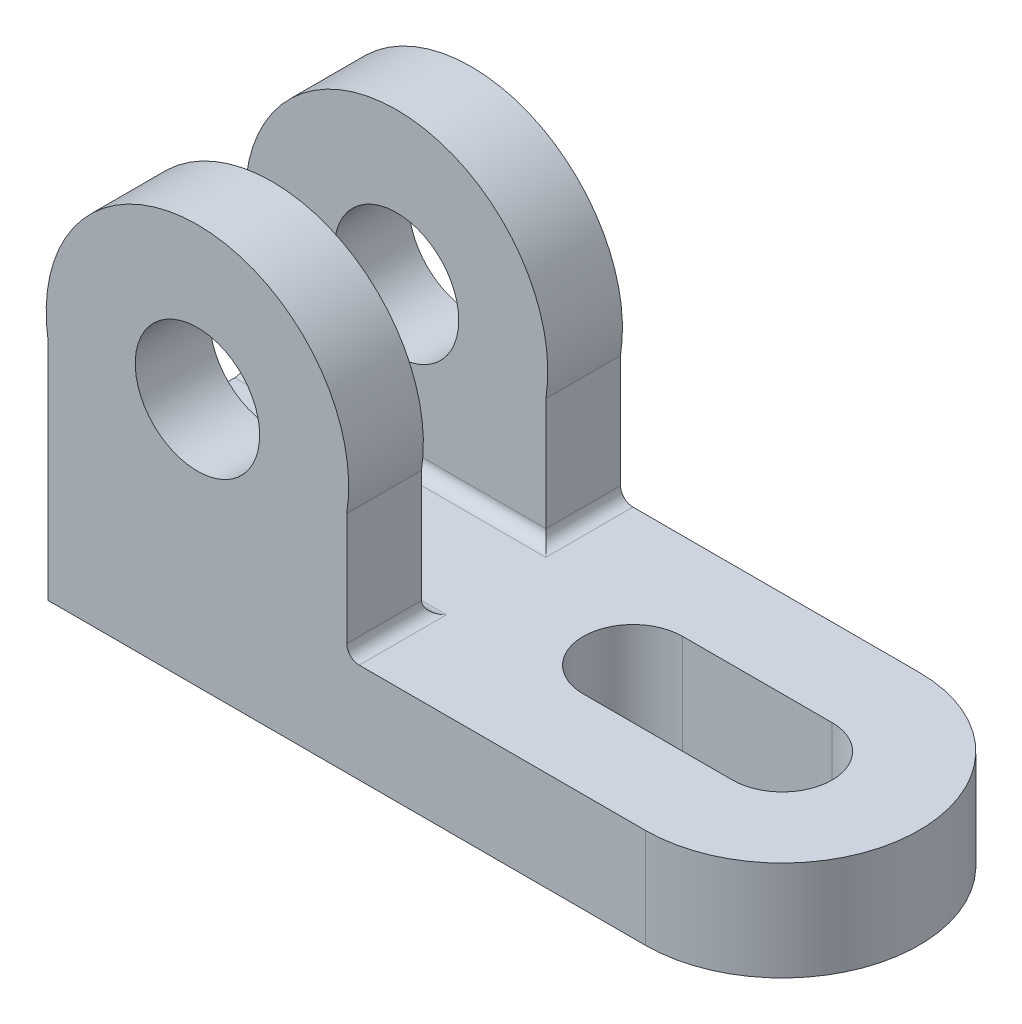
ISO-10303-21;
HEADER;
FILE_DESCRIPTION(('STEP AP214'),'2;1');
FILE_NAME('part.step','',(''),(''),'','','');
FILE_SCHEMA(('AUTOMOTIVE_DESIGN { 1 0 10303 214 1 1 1 1 }'));
ENDSEC;
DATA;
#1=APPLICATION_CONTEXT('core data for automotive mechanical design processes');
#2=APPLICATION_PROTOCOL_DEFINITION('international standard','automotive_design',2000,#1);
#3=PRODUCT_CONTEXT('',#1,'mechanical');
#4=PRODUCT('Part','Part','',(#3));
#5=PRODUCT_RELATED_PRODUCT_CATEGORY('part','',(#4));
#6=PRODUCT_DEFINITION_FORMATION('','',#4);
#7=PRODUCT_DEFINITION_CONTEXT('part definition',#1,'design');
#8=PRODUCT_DEFINITION('design','',#6,#7);
#9=PRODUCT_DEFINITION_SHAPE('','',#8);
#10=(LENGTH_UNIT() NAMED_UNIT(*) SI_UNIT(.MILLI.,.METRE.));
#11=(NAMED_UNIT(*) PLANE_ANGLE_UNIT() SI_UNIT($,.RADIAN.));
#12=(NAMED_UNIT(*) SI_UNIT($,.STERADIAN.) SOLID_ANGLE_UNIT());
#13=UNCERTAINTY_MEASURE_WITH_UNIT(LENGTH_MEASURE(1.E-05),#10,'distance_accuracy_value','');
#14=(GEOMETRIC_REPRESENTATION_CONTEXT(3) GLOBAL_UNCERTAINTY_ASSIGNED_CONTEXT((#13)) GLOBAL_UNIT_ASSIGNED_CONTEXT((#10,
#11,#12)) REPRESENTATION_CONTEXT('',''));
#15=CARTESIAN_POINT('',(0.,0.,0.));
#16=DIRECTION('',(0.,0.,1.));
#17=DIRECTION('',(1.,0.,0.));
#18=AXIS2_PLACEMENT_3D('',#15,#16,#17);
#19=CARTESIAN_POINT('',(0.,16.,0.));
#20=DIRECTION('',(0.,1.,0.));
#21=DIRECTION('',(0.,0.,1.));
#22=AXIS2_PLACEMENT_3D('',#19,#20,#21);
#23=PLANE('',#22);
#24=CARTESIAN_POINT('',(37.,16.,0.));
#25=DIRECTION('',(0.,1.,0.));
#26=DIRECTION('',(0.,0.,1.));
#27=AXIS2_PLACEMENT_3D('',#24,#25,#26);
#28=CIRCLE('',#27,8.);
#29=CARTESIAN_POINT('',(37.,16.,8.));
#30=VERTEX_POINT('',#29);
#31=CARTESIAN_POINT('',(37.,16.,-8.));
#32=VERTEX_POINT('',#31);
#33=EDGE_CURVE('E238',#30,#32,#28,.T.);
#34=ORIENTED_EDGE('',*,*,#33,.F.);
#35=DIRECTION('',(1.,0.,0.));
#36=VECTOR('',#35,1.);
#37=CARTESIAN_POINT('',(37.,16.,8.));
#38=LINE('',#37,#36);
#39=CARTESIAN_POINT('',(13.,16.,8.00000000000001));
#40=VERTEX_POINT('',#39);
#41=EDGE_CURVE('E247',#40,#30,#38,.T.);
#42=ORIENTED_EDGE('',*,*,#41,.F.);
#43=CARTESIAN_POINT('',(13.,16.,0.));
#44=DIRECTION('',(0.,1.,0.));
#45=DIRECTION('',(0.,0.,1.));
#46=AXIS2_PLACEMENT_3D('',#43,#44,#45);
#47=CIRCLE('',#46,8.00000000000001);
#48=CARTESIAN_POINT('',(13.,16.,-8.));
#49=VERTEX_POINT('',#48);
#50=EDGE_CURVE('E266',#49,#40,#47,.T.);
#51=ORIENTED_EDGE('',*,*,#50,.F.);
#52=DIRECTION('',(-1.,0.,0.));
#53=VECTOR('',#52,1.);
#54=CARTESIAN_POINT('',(37.,16.,-8.));
#55=LINE('',#54,#53);
#56=EDGE_CURVE('E262',#32,#49,#55,.T.);
#57=ORIENTED_EDGE('',*,*,#56,.F.);
#58=EDGE_LOOP('',(#34,#42,#51,#57));
#59=FACE_BOUND('',#58,.T.);
#60=DIRECTION('',(-1.,0.,0.));
#61=VECTOR('',#60,1.);
#62=CARTESIAN_POINT('',(0.,16.,8.));
#63=LINE('',#62,#61);
#64=CARTESIAN_POINT('',(-59.,16.,8.));
#65=VERTEX_POINT('',#64);
#66=CARTESIAN_POINT('',(-8.99999999999998,16.,8.));
#67=VERTEX_POINT('',#66);
#68=EDGE_CURVE('E334',#65,#67,#63,.F.);
#69=ORIENTED_EDGE('',*,*,#68,.T.);
#70=DIRECTION('',(0.,0.,1.));
#71=VECTOR('',#70,1.);
#72=CARTESIAN_POINT('',(-8.99999999999998,16.,22.));
#73=LINE('',#72,#71);
#74=CARTESIAN_POINT('',(-8.99999999999998,16.,22.));
#75=VERTEX_POINT('',#74);
#76=EDGE_CURVE('E337',#67,#75,#73,.T.);
#77=ORIENTED_EDGE('',*,*,#76,.T.);
#78=DIRECTION('',(1.,0.,0.));
#79=VECTOR('',#78,1.);
#80=CARTESIAN_POINT('',(0.,16.,22.));
#81=LINE('',#80,#79);
#82=CARTESIAN_POINT('',(37.,16.,22.));
#83=VERTEX_POINT('',#82);
#84=EDGE_CURVE('E286',#75,#83,#81,.T.);
#85=ORIENTED_EDGE('',*,*,#84,.T.);
#86=CARTESIAN_POINT('',(37.,16.,0.));
#87=DIRECTION('',(0.,1.,0.));
#88=DIRECTION('',(0.,0.,1.));
#89=AXIS2_PLACEMENT_3D('',#86,#87,#88);
#90=CIRCLE('',#89,22.);
#91=CARTESIAN_POINT('',(37.,16.,-22.));
#92=VERTEX_POINT('',#91);
#93=EDGE_CURVE('E289',#83,#92,#90,.T.);
#94=ORIENTED_EDGE('',*,*,#93,.T.);
#95=DIRECTION('',(1.,0.,0.));
#96=VECTOR('',#95,1.);
#97=CARTESIAN_POINT('',(0.,16.,-22.));
#98=LINE('',#97,#96);
#99=CARTESIAN_POINT('',(-8.99999999999998,16.,-22.));
#100=VERTEX_POINT('',#99);
#101=EDGE_CURVE('E294',#100,#92,#98,.T.);
#102=ORIENTED_EDGE('',*,*,#101,.F.);
#103=DIRECTION('',(0.,0.,-1.));
#104=VECTOR('',#103,1.);
#105=CARTESIAN_POINT('',(-8.99999999999998,16.,0.));
#106=LINE('',#105,#104);
#107=CARTESIAN_POINT('',(-8.99999999999998,16.,-8.));
#108=VERTEX_POINT('',#107);
#109=EDGE_CURVE('E331',#100,#108,#106,.F.);
#110=ORIENTED_EDGE('',*,*,#109,.T.);
#111=DIRECTION('',(-1.,0.,0.));
#112=VECTOR('',#111,1.);
#113=CARTESIAN_POINT('',(0.,16.,-8.));
#114=LINE('',#113,#112);
#115=CARTESIAN_POINT('',(-59.,16.,-8.));
#116=VERTEX_POINT('',#115);
#117=EDGE_CURVE('E328',#108,#116,#114,.T.);
#118=ORIENTED_EDGE('',*,*,#117,.T.);
#119=DIRECTION('',(0.,0.,1.));
#120=VECTOR('',#119,1.);
#121=CARTESIAN_POINT('',(-59.,16.,0.));
#122=LINE('',#121,#120);
#123=EDGE_CURVE('E297',#116,#65,#122,.T.);
#124=ORIENTED_EDGE('',*,*,#123,.T.);
#125=EDGE_LOOP('',(#69,#77,#85,#94,#102,#110,#118,#124));
#126=FACE_BOUND('',#125,.T.);
#127=ADVANCED_FACE('F43',(#59,#126),#23,.T.);
#128=CARTESIAN_POINT('',(0.,16.,22.));
#129=DIRECTION('',(0.,0.,-1.));
#130=DIRECTION('',(-1.,0.,0.));
#131=AXIS2_PLACEMENT_3D('',#128,#129,#130);
#132=PLANE('',#131);
#133=DIRECTION('',(1.,0.,0.));
#134=VECTOR('',#133,1.);
#135=CARTESIAN_POINT('',(0.,0.,22.));
#136=LINE('',#135,#134);
#137=CARTESIAN_POINT('',(-59.,0.,22.));
#138=VERTEX_POINT('',#137);
#139=CARTESIAN_POINT('',(37.,0.,22.));
#140=VERTEX_POINT('',#139);
#141=EDGE_CURVE('E276',#138,#140,#136,.T.);
#142=ORIENTED_EDGE('',*,*,#141,.T.);
#143=DIRECTION('',(0.,-1.,0.));
#144=VECTOR('',#143,1.);
#145=CARTESIAN_POINT('',(37.,16.,22.));
#146=LINE('',#145,#144);
#147=EDGE_CURVE('E324',#83,#140,#146,.T.);
#148=ORIENTED_EDGE('',*,*,#147,.F.);
#149=ORIENTED_EDGE('',*,*,#84,.F.);
#150=CARTESIAN_POINT('',(-8.99999999999998,18.,22.));
#151=DIRECTION('',(0.,0.,-1.));
#152=DIRECTION('',(-1.,0.,0.));
#153=AXIS2_PLACEMENT_3D('',#150,#151,#152);
#154=CIRCLE('',#153,2.);
#155=CARTESIAN_POINT('',(-11.,18.,22.));
#156=VERTEX_POINT('',#155);
#157=EDGE_CURVE('E352',#75,#156,#154,.T.);
#158=ORIENTED_EDGE('',*,*,#157,.T.);
#159=DIRECTION('',(0.,1.,0.));
#160=VECTOR('',#159,1.);
#161=CARTESIAN_POINT('',(-11.,0.,22.));
#162=LINE('',#161,#160);
#163=CARTESIAN_POINT('',(-11.,36.0945300116001,22.));
#164=VERTEX_POINT('',#163);
#165=EDGE_CURVE('E214',#156,#164,#162,.T.);
#166=ORIENTED_EDGE('',*,*,#165,.T.);
#167=CARTESIAN_POINT('',(-35.,40.,22.));
#168=DIRECTION('',(0.,0.,1.));
#169=DIRECTION('',(1.,0.,0.));
#170=AXIS2_PLACEMENT_3D('',#167,#168,#169);
#171=CIRCLE('',#170,24.3156882656093);
#172=CARTESIAN_POINT('',(-59.,36.0945300116001,22.));
#173=VERTEX_POINT('',#172);
#174=EDGE_CURVE('E228',#164,#173,#171,.T.);
#175=ORIENTED_EDGE('',*,*,#174,.T.);
#176=DIRECTION('',(0.,-1.,0.));
#177=VECTOR('',#176,1.);
#178=CARTESIAN_POINT('',(-59.,16.,22.));
#179=LINE('',#178,#177);
#180=EDGE_CURVE('E301',#173,#138,#179,.T.);
#181=ORIENTED_EDGE('',*,*,#180,.T.);
#182=EDGE_LOOP('',(#142,#148,#149,#158,#166,#175,#181));
#183=FACE_BOUND('',#182,.T.);
#184=CARTESIAN_POINT('',(-35.,40.,22.));
#185=DIRECTION('',(0.,0.,1.));
#186=DIRECTION('',(1.,0.,0.));
#187=AXIS2_PLACEMENT_3D('',#184,#185,#186);
#188=CIRCLE('',#187,10.);
#189=CARTESIAN_POINT('',(-25.,40.,22.));
#190=VERTEX_POINT('',#189);
#191=EDGE_CURVE('E207',#190,#190,#188,.T.);
#192=ORIENTED_EDGE('',*,*,#191,.F.);
#193=EDGE_LOOP('',(#192));
#194=FACE_BOUND('',#193,.T.);
#195=ADVANCED_FACE('F387',(#183,#194),#132,.F.);
#196=CARTESIAN_POINT('',(37.,16.,0.));
#197=DIRECTION('',(0.,-1.,0.));
#198=DIRECTION('',(0.,0.,-1.));
#199=AXIS2_PLACEMENT_3D('',#196,#197,#198);
#200=CYLINDRICAL_SURFACE('',#199,22.);
#201=CARTESIAN_POINT('',(37.,0.,0.));
#202=DIRECTION('',(0.,1.,0.));
#203=DIRECTION('',(0.,0.,1.));
#204=AXIS2_PLACEMENT_3D('',#201,#202,#203);
#205=CIRCLE('',#204,22.);
#206=CARTESIAN_POINT('',(37.,0.,-22.));
#207=VERTEX_POINT('',#206);
#208=EDGE_CURVE('E305',#140,#207,#205,.T.);
#209=ORIENTED_EDGE('',*,*,#208,.T.);
#210=DIRECTION('',(0.,-1.,0.));
#211=VECTOR('',#210,1.);
#212=CARTESIAN_POINT('',(37.,16.,-22.));
#213=LINE('',#212,#211);
#214=EDGE_CURVE('E321',#92,#207,#213,.T.);
#215=ORIENTED_EDGE('',*,*,#214,.F.);
#216=ORIENTED_EDGE('',*,*,#93,.F.);
#217=ORIENTED_EDGE('',*,*,#147,.T.);
#218=EDGE_LOOP('',(#209,#215,#216,#217));
#219=FACE_BOUND('',#218,.T.);
#220=ADVANCED_FACE('F392',(#219),#200,.T.);
#221=CARTESIAN_POINT('',(0.,16.,-22.));
#222=DIRECTION('',(0.,0.,-1.));
#223=DIRECTION('',(-1.,0.,0.));
#224=AXIS2_PLACEMENT_3D('',#221,#222,#223);
#225=PLANE('',#224);
#226=DIRECTION('',(1.,0.,0.));
#227=VECTOR('',#226,1.);
#228=CARTESIAN_POINT('',(0.,0.,-22.));
#229=LINE('',#228,#227);
#230=CARTESIAN_POINT('',(-59.,0.,-22.));
#231=VERTEX_POINT('',#230);
#232=EDGE_CURVE('E309',#231,#207,#229,.T.);
#233=ORIENTED_EDGE('',*,*,#232,.F.);
#234=DIRECTION('',(0.,-1.,0.));
#235=VECTOR('',#234,1.);
#236=CARTESIAN_POINT('',(-59.,16.,-22.));
#237=LINE('',#236,#235);
#238=CARTESIAN_POINT('',(-59.,36.0945300116001,-22.));
#239=VERTEX_POINT('',#238);
#240=EDGE_CURVE('E318',#239,#231,#237,.T.);
#241=ORIENTED_EDGE('',*,*,#240,.F.);
#242=CARTESIAN_POINT('',(-35.,40.,-22.));
#243=DIRECTION('',(0.,0.,1.));
#244=DIRECTION('',(1.,0.,0.));
#245=AXIS2_PLACEMENT_3D('',#242,#243,#244);
#246=CIRCLE('',#245,24.3156882656093);
#247=CARTESIAN_POINT('',(-11.,36.0945300116001,-22.));
#248=VERTEX_POINT('',#247);
#249=EDGE_CURVE('E200',#248,#239,#246,.T.);
#250=ORIENTED_EDGE('',*,*,#249,.F.);
#251=DIRECTION('',(0.,1.,0.));
#252=VECTOR('',#251,1.);
#253=CARTESIAN_POINT('',(-11.,0.,-22.));
#254=LINE('',#253,#252);
#255=CARTESIAN_POINT('',(-11.,18.,-22.));
#256=VERTEX_POINT('',#255);
#257=EDGE_CURVE('E178',#256,#248,#254,.T.);
#258=ORIENTED_EDGE('',*,*,#257,.F.);
#259=CARTESIAN_POINT('',(-8.99999999999998,18.,-22.));
#260=DIRECTION('',(0.,0.,-1.));
#261=DIRECTION('',(-1.,0.,0.));
#262=AXIS2_PLACEMENT_3D('',#259,#260,#261);
#263=CIRCLE('',#262,2.);
#264=EDGE_CURVE('E53',#256,#100,#263,.F.);
#265=ORIENTED_EDGE('',*,*,#264,.T.);
#266=ORIENTED_EDGE('',*,*,#101,.T.);
#267=ORIENTED_EDGE('',*,*,#214,.T.);
#268=EDGE_LOOP('',(#233,#241,#250,#258,#265,#266,#267));
#269=FACE_BOUND('',#268,.T.);
#270=CARTESIAN_POINT('',(-35.,40.,-22.));
#271=DIRECTION('',(0.,0.,1.));
#272=DIRECTION('',(1.,0.,0.));
#273=AXIS2_PLACEMENT_3D('',#270,#271,#272);
#274=CIRCLE('',#273,10.);
#275=CARTESIAN_POINT('',(-25.,40.,-22.));
#276=VERTEX_POINT('',#275);
#277=EDGE_CURVE('E196',#276,#276,#274,.T.);
#278=ORIENTED_EDGE('',*,*,#277,.T.);
#279=EDGE_LOOP('',(#278));
#280=FACE_BOUND('',#279,.T.);
#281=ADVANCED_FACE('F396',(#269,#280),#225,.T.);
#282=CARTESIAN_POINT('',(-59.,16.,0.));
#283=DIRECTION('',(1.,0.,0.));
#284=DIRECTION('',(0.,0.,-1.));
#285=AXIS2_PLACEMENT_3D('',#282,#283,#284);
#286=PLANE('',#285);
#287=DIRECTION('',(0.,0.,1.));
#288=VECTOR('',#287,1.);
#289=CARTESIAN_POINT('',(-59.,0.,0.));
#290=LINE('',#289,#288);
#291=EDGE_CURVE('E290',#231,#138,#290,.T.);
#292=ORIENTED_EDGE('',*,*,#291,.T.);
#293=ORIENTED_EDGE('',*,*,#180,.F.);
#294=DIRECTION('',(0.,0.,1.));
#295=VECTOR('',#294,1.);
#296=CARTESIAN_POINT('',(-59.,36.0945300116001,10.));
#297=LINE('',#296,#295);
#298=CARTESIAN_POINT('',(-59.,36.0945300116001,10.));
#299=VERTEX_POINT('',#298);
#300=EDGE_CURVE('E224',#299,#173,#297,.T.);
#301=ORIENTED_EDGE('',*,*,#300,.F.);
#302=DIRECTION('',(0.,1.,0.));
#303=VECTOR('',#302,1.);
#304=CARTESIAN_POINT('',(-59.,0.,10.));
#305=LINE('',#304,#303);
#306=CARTESIAN_POINT('',(-59.,18.,10.));
#307=VERTEX_POINT('',#306);
#308=EDGE_CURVE('E218',#307,#299,#305,.T.);
#309=ORIENTED_EDGE('',*,*,#308,.F.);
#310=CARTESIAN_POINT('',(-59.,18.,8.));
#311=DIRECTION('',(1.,0.,0.));
#312=DIRECTION('',(0.,0.,-1.));
#313=AXIS2_PLACEMENT_3D('',#310,#311,#312);
#314=CIRCLE('',#313,2.);
#315=EDGE_CURVE('E355',#307,#65,#314,.T.);
#316=ORIENTED_EDGE('',*,*,#315,.T.);
#317=ORIENTED_EDGE('',*,*,#123,.F.);
#318=CARTESIAN_POINT('',(-59.,18.,-8.));
#319=DIRECTION('',(1.,0.,0.));
#320=DIRECTION('',(0.,0.,-1.));
#321=AXIS2_PLACEMENT_3D('',#318,#319,#320);
#322=CIRCLE('',#321,2.);
#323=CARTESIAN_POINT('',(-59.,18.,-10.));
#324=VERTEX_POINT('',#323);
#325=EDGE_CURVE('E11',#116,#324,#322,.T.);
#326=ORIENTED_EDGE('',*,*,#325,.T.);
#327=DIRECTION('',(0.,1.,0.));
#328=VECTOR('',#327,1.);
#329=CARTESIAN_POINT('',(-59.,0.,-10.));
#330=LINE('',#329,#328);
#331=CARTESIAN_POINT('',(-59.,36.0945300116001,-10.));
#332=VERTEX_POINT('',#331);
#333=EDGE_CURVE('E172',#324,#332,#330,.T.);
#334=ORIENTED_EDGE('',*,*,#333,.T.);
#335=DIRECTION('',(0.,0.,-1.));
#336=VECTOR('',#335,1.);
#337=CARTESIAN_POINT('',(-59.,36.0945300116001,-10.));
#338=LINE('',#337,#336);
#339=EDGE_CURVE('E183',#332,#239,#338,.T.);
#340=ORIENTED_EDGE('',*,*,#339,.T.);
#341=ORIENTED_EDGE('',*,*,#240,.T.);
#342=EDGE_LOOP('',(#292,#293,#301,#309,#316,#317,#326,#334,#340,#341));
#343=FACE_BOUND('',#342,.T.);
#344=ADVANCED_FACE('F376',(#343),#286,.F.);
#345=CARTESIAN_POINT('',(0.,0.,0.));
#346=DIRECTION('',(0.,1.,0.));
#347=DIRECTION('',(0.,0.,1.));
#348=AXIS2_PLACEMENT_3D('',#345,#346,#347);
#349=PLANE('',#348);
#350=DIRECTION('',(1.,0.,0.));
#351=VECTOR('',#350,1.);
#352=CARTESIAN_POINT('',(37.,0.,8.));
#353=LINE('',#352,#351);
#354=CARTESIAN_POINT('',(13.,0.,8.00000000000001));
#355=VERTEX_POINT('',#354);
#356=CARTESIAN_POINT('',(37.,0.,8.));
#357=VERTEX_POINT('',#356);
#358=EDGE_CURVE('E255',#355,#357,#353,.T.);
#359=ORIENTED_EDGE('',*,*,#358,.T.);
#360=CARTESIAN_POINT('',(37.,0.,0.));
#361=DIRECTION('',(0.,1.,0.));
#362=DIRECTION('',(0.,0.,1.));
#363=AXIS2_PLACEMENT_3D('',#360,#361,#362);
#364=CIRCLE('',#363,8.);
#365=CARTESIAN_POINT('',(37.,0.,-8.));
#366=VERTEX_POINT('',#365);
#367=EDGE_CURVE('E242',#357,#366,#364,.T.);
#368=ORIENTED_EDGE('',*,*,#367,.T.);
#369=DIRECTION('',(-1.,0.,0.));
#370=VECTOR('',#369,1.);
#371=CARTESIAN_POINT('',(37.,0.,-8.));
#372=LINE('',#371,#370);
#373=CARTESIAN_POINT('',(13.,0.,-8.));
#374=VERTEX_POINT('',#373);
#375=EDGE_CURVE('E246',#366,#374,#372,.T.);
#376=ORIENTED_EDGE('',*,*,#375,.T.);
#377=CARTESIAN_POINT('',(13.,0.,0.));
#378=DIRECTION('',(0.,1.,0.));
#379=DIRECTION('',(0.,0.,1.));
#380=AXIS2_PLACEMENT_3D('',#377,#378,#379);
#381=CIRCLE('',#380,8.00000000000001);
#382=EDGE_CURVE('E251',#374,#355,#381,.T.);
#383=ORIENTED_EDGE('',*,*,#382,.T.);
#384=EDGE_LOOP('',(#359,#368,#376,#383));
#385=FACE_BOUND('',#384,.T.);
#386=ORIENTED_EDGE('',*,*,#141,.F.);
#387=ORIENTED_EDGE('',*,*,#291,.F.);
#388=ORIENTED_EDGE('',*,*,#232,.T.);
#389=ORIENTED_EDGE('',*,*,#208,.F.);
#390=EDGE_LOOP('',(#386,#387,#388,#389));
#391=FACE_BOUND('',#390,.T.);
#392=ADVANCED_FACE('F400',(#385,#391),#349,.F.);
#393=CARTESIAN_POINT('',(37.,0.,0.));
#394=DIRECTION('',(0.,1.,0.));
#395=DIRECTION('',(0.,0.,1.));
#396=AXIS2_PLACEMENT_3D('',#393,#394,#395);
#397=CYLINDRICAL_SURFACE('',#396,8.);
#398=ORIENTED_EDGE('',*,*,#33,.T.);
#399=DIRECTION('',(0.,1.,0.));
#400=VECTOR('',#399,1.);
#401=CARTESIAN_POINT('',(37.,0.,-8.));
#402=LINE('',#401,#400);
#403=EDGE_CURVE('E259',#366,#32,#402,.T.);
#404=ORIENTED_EDGE('',*,*,#403,.F.);
#405=ORIENTED_EDGE('',*,*,#367,.F.);
#406=DIRECTION('',(0.,1.,0.));
#407=VECTOR('',#406,1.);
#408=CARTESIAN_POINT('',(37.,0.,8.));
#409=LINE('',#408,#407);
#410=EDGE_CURVE('E273',#357,#30,#409,.T.);
#411=ORIENTED_EDGE('',*,*,#410,.T.);
#412=EDGE_LOOP('',(#398,#404,#405,#411));
#413=FACE_BOUND('',#412,.T.);
#414=ADVANCED_FACE('F402',(#413),#397,.F.);
#415=CARTESIAN_POINT('',(37.,0.,8.));
#416=DIRECTION('',(0.,0.,1.));
#417=DIRECTION('',(1.,0.,0.));
#418=AXIS2_PLACEMENT_3D('',#415,#416,#417);
#419=PLANE('',#418);
#420=ORIENTED_EDGE('',*,*,#41,.T.);
#421=ORIENTED_EDGE('',*,*,#410,.F.);
#422=ORIENTED_EDGE('',*,*,#358,.F.);
#423=DIRECTION('',(0.,1.,0.));
#424=VECTOR('',#423,1.);
#425=CARTESIAN_POINT('',(13.,0.,8.00000000000001));
#426=LINE('',#425,#424);
#427=EDGE_CURVE('E277',#355,#40,#426,.T.);
#428=ORIENTED_EDGE('',*,*,#427,.T.);
#429=EDGE_LOOP('',(#420,#421,#422,#428));
#430=FACE_BOUND('',#429,.T.);
#431=ADVANCED_FACE('F409',(#430),#419,.F.);
#432=CARTESIAN_POINT('',(13.,0.,0.));
#433=DIRECTION('',(0.,1.,0.));
#434=DIRECTION('',(0.,0.,1.));
#435=AXIS2_PLACEMENT_3D('',#432,#433,#434);
#436=CYLINDRICAL_SURFACE('',#435,8.00000000000001);
#437=ORIENTED_EDGE('',*,*,#50,.T.);
#438=ORIENTED_EDGE('',*,*,#427,.F.);
#439=ORIENTED_EDGE('',*,*,#382,.F.);
#440=DIRECTION('',(0.,1.,0.));
#441=VECTOR('',#440,1.);
#442=CARTESIAN_POINT('',(13.,0.,-8.));
#443=LINE('',#442,#441);
#444=EDGE_CURVE('E280',#374,#49,#443,.T.);
#445=ORIENTED_EDGE('',*,*,#444,.T.);
#446=EDGE_LOOP('',(#437,#438,#439,#445));
#447=FACE_BOUND('',#446,.T.);
#448=ADVANCED_FACE('F426',(#447),#436,.F.);
#449=CARTESIAN_POINT('',(37.,0.,-8.));
#450=DIRECTION('',(0.,0.,-1.));
#451=DIRECTION('',(-1.,0.,0.));
#452=AXIS2_PLACEMENT_3D('',#449,#450,#451);
#453=PLANE('',#452);
#454=ORIENTED_EDGE('',*,*,#56,.T.);
#455=ORIENTED_EDGE('',*,*,#444,.F.);
#456=ORIENTED_EDGE('',*,*,#375,.F.);
#457=ORIENTED_EDGE('',*,*,#403,.T.);
#458=EDGE_LOOP('',(#454,#455,#456,#457));
#459=FACE_BOUND('',#458,.T.);
#460=ADVANCED_FACE('F422',(#459),#453,.F.);
#461=CARTESIAN_POINT('',(-35.,40.,10.));
#462=DIRECTION('',(0.,0.,1.));
#463=DIRECTION('',(1.,0.,0.));
#464=AXIS2_PLACEMENT_3D('',#461,#462,#463);
#465=CYLINDRICAL_SURFACE('',#464,24.3156882656093);
#466=ORIENTED_EDGE('',*,*,#174,.F.);
#467=DIRECTION('',(0.,0.,1.));
#468=VECTOR('',#467,1.);
#469=CARTESIAN_POINT('',(-11.,36.0945300116001,10.));
#470=LINE('',#469,#468);
#471=CARTESIAN_POINT('',(-11.,36.0945300116001,10.));
#472=VERTEX_POINT('',#471);
#473=EDGE_CURVE('E234',#472,#164,#470,.T.);
#474=ORIENTED_EDGE('',*,*,#473,.F.);
#475=CARTESIAN_POINT('',(-35.,40.,10.));
#476=DIRECTION('',(0.,0.,1.));
#477=DIRECTION('',(1.,0.,0.));
#478=AXIS2_PLACEMENT_3D('',#475,#476,#477);
#479=CIRCLE('',#478,24.3156882656093);
#480=EDGE_CURVE('E213',#472,#299,#479,.T.);
#481=ORIENTED_EDGE('',*,*,#480,.T.);
#482=ORIENTED_EDGE('',*,*,#300,.T.);
#483=EDGE_LOOP('',(#466,#474,#481,#482));
#484=FACE_BOUND('',#483,.T.);
#485=ADVANCED_FACE('F425',(#484),#465,.T.);
#486=CARTESIAN_POINT('',(-11.,0.,10.));
#487=DIRECTION('',(1.,0.,0.));
#488=DIRECTION('',(0.,0.,-1.));
#489=AXIS2_PLACEMENT_3D('',#486,#487,#488);
#490=PLANE('',#489);
#491=ORIENTED_EDGE('',*,*,#165,.F.);
#492=DIRECTION('',(0.,0.,1.));
#493=VECTOR('',#492,1.);
#494=CARTESIAN_POINT('',(-11.,18.,10.));
#495=LINE('',#494,#493);
#496=CARTESIAN_POINT('',(-11.,18.,10.));
#497=VERTEX_POINT('',#496);
#498=EDGE_CURVE('E341',#156,#497,#495,.F.);
#499=ORIENTED_EDGE('',*,*,#498,.T.);
#500=DIRECTION('',(0.,1.,0.));
#501=VECTOR('',#500,1.);
#502=CARTESIAN_POINT('',(-11.,0.,10.));
#503=LINE('',#502,#501);
#504=EDGE_CURVE('E221',#497,#472,#503,.T.);
#505=ORIENTED_EDGE('',*,*,#504,.T.);
#506=ORIENTED_EDGE('',*,*,#473,.T.);
#507=EDGE_LOOP('',(#491,#499,#505,#506));
#508=FACE_BOUND('',#507,.T.);
#509=ADVANCED_FACE('F438',(#508),#490,.T.);
#510=CARTESIAN_POINT('',(-35.,40.,10.));
#511=DIRECTION('',(0.,0.,1.));
#512=DIRECTION('',(1.,0.,0.));
#513=AXIS2_PLACEMENT_3D('',#510,#511,#512);
#514=CYLINDRICAL_SURFACE('',#513,10.);
#515=CARTESIAN_POINT('',(-35.,40.,10.));
#516=DIRECTION('',(0.,0.,1.));
#517=DIRECTION('',(1.,0.,0.));
#518=AXIS2_PLACEMENT_3D('',#515,#516,#517);
#519=CIRCLE('',#518,10.);
#520=CARTESIAN_POINT('',(-25.,40.,10.));
#521=VERTEX_POINT('',#520);
#522=EDGE_CURVE('E209',#521,#521,#519,.T.);
#523=ORIENTED_EDGE('',*,*,#522,.F.);
#524=EDGE_LOOP('',(#523));
#525=FACE_BOUND('',#524,.T.);
#526=ORIENTED_EDGE('',*,*,#191,.T.);
#527=EDGE_LOOP('',(#526));
#528=FACE_BOUND('',#527,.T.);
#529=ADVANCED_FACE('F434',(#525,#528),#514,.F.);
#530=CARTESIAN_POINT('',(0.,0.,10.));
#531=DIRECTION('',(0.,0.,1.));
#532=DIRECTION('',(1.,0.,0.));
#533=AXIS2_PLACEMENT_3D('',#530,#531,#532);
#534=PLANE('',#533);
#535=ORIENTED_EDGE('',*,*,#522,.T.);
#536=EDGE_LOOP('',(#535));
#537=FACE_BOUND('',#536,.T.);
#538=ORIENTED_EDGE('',*,*,#504,.F.);
#539=DIRECTION('',(-1.,0.,0.));
#540=VECTOR('',#539,1.);
#541=CARTESIAN_POINT('',(0.,18.,10.));
#542=LINE('',#541,#540);
#543=EDGE_CURVE('E344',#497,#307,#542,.T.);
#544=ORIENTED_EDGE('',*,*,#543,.T.);
#545=ORIENTED_EDGE('',*,*,#308,.T.);
#546=ORIENTED_EDGE('',*,*,#480,.F.);
#547=EDGE_LOOP('',(#538,#544,#545,#546));
#548=FACE_BOUND('',#547,.T.);
#549=ADVANCED_FACE('F437',(#537,#548),#534,.F.);
#550=CARTESIAN_POINT('',(-35.,40.,-10.));
#551=DIRECTION('',(0.,0.,-1.));
#552=DIRECTION('',(-1.,0.,0.));
#553=AXIS2_PLACEMENT_3D('',#550,#551,#552);
#554=CYLINDRICAL_SURFACE('',#553,24.3156882656093);
#555=ORIENTED_EDGE('',*,*,#249,.T.);
#556=ORIENTED_EDGE('',*,*,#339,.F.);
#557=CARTESIAN_POINT('',(-35.,40.,-10.));
#558=DIRECTION('',(0.,0.,1.));
#559=DIRECTION('',(1.,0.,0.));
#560=AXIS2_PLACEMENT_3D('',#557,#558,#559);
#561=CIRCLE('',#560,24.3156882656093);
#562=CARTESIAN_POINT('',(-11.,36.0945300116001,-10.));
#563=VERTEX_POINT('',#562);
#564=EDGE_CURVE('E166',#563,#332,#561,.T.);
#565=ORIENTED_EDGE('',*,*,#564,.F.);
#566=DIRECTION('',(0.,0.,-1.));
#567=VECTOR('',#566,1.);
#568=CARTESIAN_POINT('',(-11.,36.0945300116001,-10.));
#569=LINE('',#568,#567);
#570=EDGE_CURVE('E175',#563,#248,#569,.T.);
#571=ORIENTED_EDGE('',*,*,#570,.T.);
#572=EDGE_LOOP('',(#555,#556,#565,#571));
#573=FACE_BOUND('',#572,.T.);
#574=ADVANCED_FACE('F185',(#573),#554,.T.);
#575=CARTESIAN_POINT('',(-35.,40.,-10.));
#576=DIRECTION('',(0.,0.,-1.));
#577=DIRECTION('',(-1.,0.,0.));
#578=AXIS2_PLACEMENT_3D('',#575,#576,#577);
#579=CYLINDRICAL_SURFACE('',#578,10.);
#580=CARTESIAN_POINT('',(-35.,40.,-10.));
#581=DIRECTION('',(0.,0.,1.));
#582=DIRECTION('',(1.,0.,0.));
#583=AXIS2_PLACEMENT_3D('',#580,#581,#582);
#584=CIRCLE('',#583,10.);
#585=CARTESIAN_POINT('',(-25.,40.,-10.));
#586=VERTEX_POINT('',#585);
#587=EDGE_CURVE('E188',#586,#586,#584,.T.);
#588=ORIENTED_EDGE('',*,*,#587,.T.);
#589=EDGE_LOOP('',(#588));
#590=FACE_BOUND('',#589,.T.);
#591=ORIENTED_EDGE('',*,*,#277,.F.);
#592=EDGE_LOOP('',(#591));
#593=FACE_BOUND('',#592,.T.);
#594=ADVANCED_FACE('F449',(#590,#593),#579,.F.);
#595=CARTESIAN_POINT('',(-11.,0.,-10.));
#596=DIRECTION('',(-1.,0.,0.));
#597=DIRECTION('',(0.,0.,1.));
#598=AXIS2_PLACEMENT_3D('',#595,#596,#597);
#599=PLANE('',#598);
#600=DIRECTION('',(0.,1.,0.));
#601=VECTOR('',#600,1.);
#602=CARTESIAN_POINT('',(-11.,0.,-10.));
#603=LINE('',#602,#601);
#604=CARTESIAN_POINT('',(-11.,18.,-10.));
#605=VERTEX_POINT('',#604);
#606=EDGE_CURVE('E162',#605,#563,#603,.T.);
#607=ORIENTED_EDGE('',*,*,#606,.F.);
#608=DIRECTION('',(0.,0.,-1.));
#609=VECTOR('',#608,1.);
#610=CARTESIAN_POINT('',(-11.,18.,-10.));
#611=LINE('',#610,#609);
#612=EDGE_CURVE('E347',#605,#256,#611,.T.);
#613=ORIENTED_EDGE('',*,*,#612,.T.);
#614=ORIENTED_EDGE('',*,*,#257,.T.);
#615=ORIENTED_EDGE('',*,*,#570,.F.);
#616=EDGE_LOOP('',(#607,#613,#614,#615));
#617=FACE_BOUND('',#616,.T.);
#618=ADVANCED_FACE('F176',(#617),#599,.F.);
#619=CARTESIAN_POINT('',(0.,0.,-10.));
#620=DIRECTION('',(0.,0.,-1.));
#621=DIRECTION('',(1.,0.,0.));
#622=AXIS2_PLACEMENT_3D('',#619,#620,#621);
#623=PLANE('',#622);
#624=ORIENTED_EDGE('',*,*,#587,.F.);
#625=EDGE_LOOP('',(#624));
#626=FACE_BOUND('',#625,.T.);
#627=ORIENTED_EDGE('',*,*,#333,.F.);
#628=DIRECTION('',(-1.,0.,0.));
#629=VECTOR('',#628,1.);
#630=CARTESIAN_POINT('',(0.,18.,-10.));
#631=LINE('',#630,#629);
#632=EDGE_CURVE('E66',#324,#605,#631,.F.);
#633=ORIENTED_EDGE('',*,*,#632,.T.);
#634=ORIENTED_EDGE('',*,*,#606,.T.);
#635=ORIENTED_EDGE('',*,*,#564,.T.);
#636=EDGE_LOOP('',(#627,#633,#634,#635));
#637=FACE_BOUND('',#636,.T.);
#638=ADVANCED_FACE('F164',(#626,#637),#623,.F.);
#639=CARTESIAN_POINT('',(0.,18.,8.));
#640=DIRECTION('',(-1.,0.,0.));
#641=DIRECTION('',(0.,0.,1.));
#642=AXIS2_PLACEMENT_3D('',#639,#640,#641);
#643=CYLINDRICAL_SURFACE('',#642,2.);
#644=ORIENTED_EDGE('',*,*,#315,.F.);
#645=ORIENTED_EDGE('',*,*,#543,.F.);
#646=CARTESIAN_POINT('',(-8.99999999999998,18.,8.));
#647=DIRECTION('',(-0.707106781186547,0.,-0.707106781186547));
#648=DIRECTION('',(-0.707106781186547,0.,0.707106781186547));
#649=AXIS2_PLACEMENT_3D('',#646,#647,#648);
#650=ELLIPSE('',#649,2.82842712474619,2.);
#651=EDGE_CURVE('E201',#67,#497,#650,.T.);
#652=ORIENTED_EDGE('',*,*,#651,.F.);
#653=ORIENTED_EDGE('',*,*,#68,.F.);
#654=EDGE_LOOP('',(#644,#645,#652,#653));
#655=FACE_BOUND('',#654,.T.);
#656=ADVANCED_FACE('F382',(#655),#643,.F.);
#657=CARTESIAN_POINT('',(-8.99999999999998,18.,0.));
#658=DIRECTION('',(0.,0.,-1.));
#659=DIRECTION('',(-1.,0.,0.));
#660=AXIS2_PLACEMENT_3D('',#657,#658,#659);
#661=CYLINDRICAL_SURFACE('',#660,2.);
#662=ORIENTED_EDGE('',*,*,#651,.T.);
#663=ORIENTED_EDGE('',*,*,#498,.F.);
#664=ORIENTED_EDGE('',*,*,#157,.F.);
#665=ORIENTED_EDGE('',*,*,#76,.F.);
#666=EDGE_LOOP('',(#662,#663,#664,#665));
#667=FACE_BOUND('',#666,.T.);
#668=ADVANCED_FACE('F462',(#667),#661,.F.);
#669=CARTESIAN_POINT('',(0.,18.,-8.));
#670=DIRECTION('',(-1.,0.,0.));
#671=DIRECTION('',(0.,0.,1.));
#672=AXIS2_PLACEMENT_3D('',#669,#670,#671);
#673=CYLINDRICAL_SURFACE('',#672,2.);
#674=ORIENTED_EDGE('',*,*,#325,.F.);
#675=ORIENTED_EDGE('',*,*,#117,.F.);
#676=CARTESIAN_POINT('',(-8.99999999999998,18.,-8.));
#677=DIRECTION('',(-0.707106781186547,0.,0.707106781186547));
#678=DIRECTION('',(-0.707106781186547,0.,-0.707106781186547));
#679=AXIS2_PLACEMENT_3D('',#676,#677,#678);
#680=ELLIPSE('',#679,2.82842712474619,2.);
#681=EDGE_CURVE('E47',#605,#108,#680,.T.);
#682=ORIENTED_EDGE('',*,*,#681,.F.);
#683=ORIENTED_EDGE('',*,*,#632,.F.);
#684=EDGE_LOOP('',(#674,#675,#682,#683));
#685=FACE_BOUND('',#684,.T.);
#686=ADVANCED_FACE('F45',(#685),#673,.F.);
#687=CARTESIAN_POINT('',(-8.99999999999998,18.,-10.));
#688=DIRECTION('',(0.,0.,-1.));
#689=DIRECTION('',(-1.,0.,0.));
#690=AXIS2_PLACEMENT_3D('',#687,#688,#689);
#691=CYLINDRICAL_SURFACE('',#690,2.);
#692=ORIENTED_EDGE('',*,*,#681,.T.);
#693=ORIENTED_EDGE('',*,*,#109,.F.);
#694=ORIENTED_EDGE('',*,*,#264,.F.);
#695=ORIENTED_EDGE('',*,*,#612,.F.);
#696=EDGE_LOOP('',(#692,#693,#694,#695));
#697=FACE_BOUND('',#696,.T.);
#698=ADVANCED_FACE('F370',(#697),#691,.F.);
#699=CLOSED_SHELL('',(#127,#195,#220,#281,#344,#392,#414,#431,#448,#460,#485,#509,#529,#549,
#574,#594,#618,#638,#656,#668,#686,#698));
#700=MANIFOLD_SOLID_BREP('B2',#699);
#701=ADVANCED_BREP_SHAPE_REPRESENTATION('',(#18,#700),#14);
#702=SHAPE_DEFINITION_REPRESENTATION(#9,#701);
ENDSEC;
END-ISO-10303-21;
